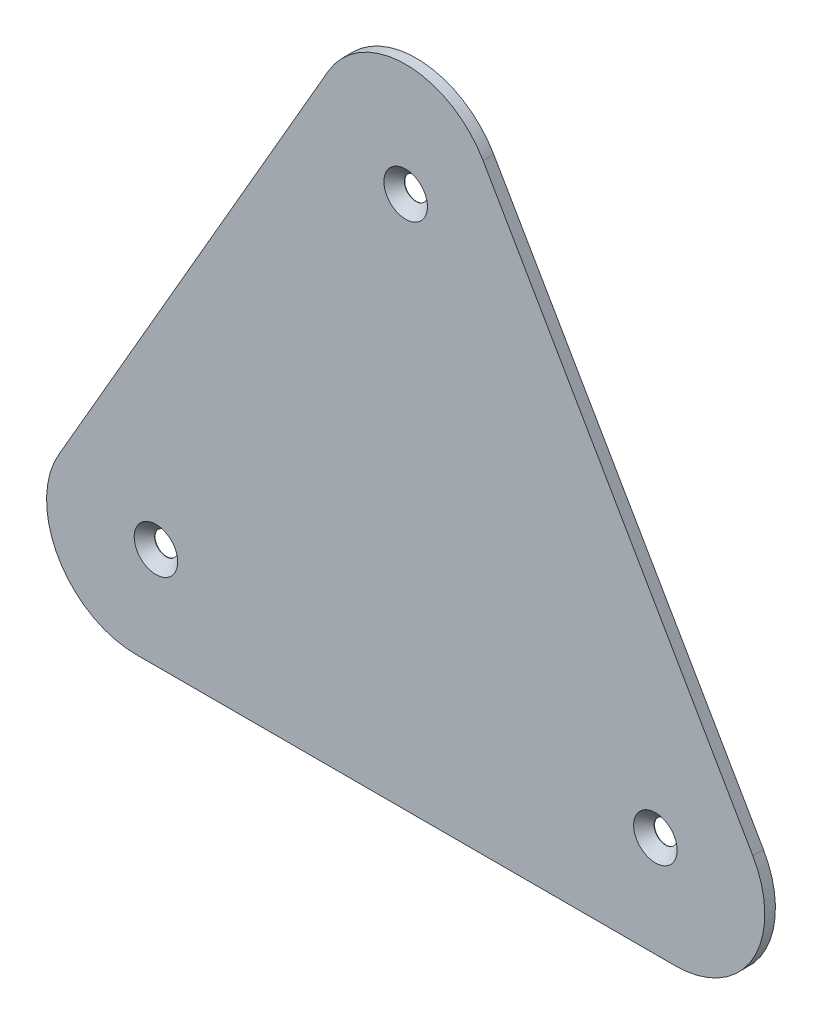
ISO-10303-21;
HEADER;
FILE_DESCRIPTION(('STEP AP214'),'2;1');
FILE_NAME('part.step','',(''),(''),'','','');
FILE_SCHEMA(('AUTOMOTIVE_DESIGN { 1 0 10303 214 1 1 1 1 }'));
ENDSEC;
DATA;
#1=APPLICATION_CONTEXT('core data for automotive mechanical design processes');
#2=APPLICATION_PROTOCOL_DEFINITION('international standard','automotive_design',2000,#1);
#3=PRODUCT_CONTEXT('',#1,'mechanical');
#4=PRODUCT('Part','Part','',(#3));
#5=PRODUCT_RELATED_PRODUCT_CATEGORY('part','',(#4));
#6=PRODUCT_DEFINITION_FORMATION('','',#4);
#7=PRODUCT_DEFINITION_CONTEXT('part definition',#1,'design');
#8=PRODUCT_DEFINITION('design','',#6,#7);
#9=PRODUCT_DEFINITION_SHAPE('','',#8);
#10=(LENGTH_UNIT() NAMED_UNIT(*) SI_UNIT(.MILLI.,.METRE.));
#11=(NAMED_UNIT(*) PLANE_ANGLE_UNIT() SI_UNIT($,.RADIAN.));
#12=(NAMED_UNIT(*) SI_UNIT($,.STERADIAN.) SOLID_ANGLE_UNIT());
#13=UNCERTAINTY_MEASURE_WITH_UNIT(LENGTH_MEASURE(1.E-05),#10,'distance_accuracy_value','');
#14=(GEOMETRIC_REPRESENTATION_CONTEXT(3) GLOBAL_UNCERTAINTY_ASSIGNED_CONTEXT((#13)) GLOBAL_UNIT_ASSIGNED_CONTEXT((#10,
#11,#12)) REPRESENTATION_CONTEXT('',''));
#15=CARTESIAN_POINT('',(0.,0.,0.));
#16=DIRECTION('',(0.,0.,1.));
#17=DIRECTION('',(1.,0.,0.));
#18=AXIS2_PLACEMENT_3D('',#15,#16,#17);
#19=CARTESIAN_POINT('',(-128.587500000001,-74.2400277394202,5.08));
#20=DIRECTION('',(0.,0.,-1.));
#21=DIRECTION('',(-1.,0.,0.));
#22=AXIS2_PLACEMENT_3D('',#19,#20,#21);
#23=CYLINDRICAL_SURFACE('',#22,42.6274583908688);
#24=CARTESIAN_POINT('',(-128.587500000001,-74.2400277394202,0.));
#25=DIRECTION('',(0.,0.,1.));
#26=DIRECTION('',(1.,0.,0.));
#27=AXIS2_PLACEMENT_3D('',#24,#25,#26);
#28=CIRCLE('',#27,42.6274583908688);
#29=CARTESIAN_POINT('',(-165.503961865257,-52.9262985439855,0.));
#30=VERTEX_POINT('',#29);
#31=CARTESIAN_POINT('',(-128.587499999999,-116.867486130289,0.));
#32=VERTEX_POINT('',#31);
#33=EDGE_CURVE('E120',#30,#32,#28,.T.);
#34=ORIENTED_EDGE('',*,*,#33,.T.);
#35=DIRECTION('',(0.,0.,-1.));
#36=VECTOR('',#35,1.);
#37=CARTESIAN_POINT('',(-128.587499999999,-116.867486130289,5.08));
#38=LINE('',#37,#36);
#39=CARTESIAN_POINT('',(-128.587499999999,-116.867486130289,5.08));
#40=VERTEX_POINT('',#39);
#41=EDGE_CURVE('E11',#40,#32,#38,.T.);
#42=ORIENTED_EDGE('',*,*,#41,.F.);
#43=CARTESIAN_POINT('',(-128.587500000001,-74.2400277394202,5.08));
#44=DIRECTION('',(0.,0.,1.));
#45=DIRECTION('',(1.,0.,0.));
#46=AXIS2_PLACEMENT_3D('',#43,#44,#45);
#47=CIRCLE('',#46,42.6274583908688);
#48=CARTESIAN_POINT('',(-165.503961865257,-52.9262985439855,5.08));
#49=VERTEX_POINT('',#48);
#50=EDGE_CURVE('E131',#49,#40,#47,.T.);
#51=ORIENTED_EDGE('',*,*,#50,.F.);
#52=DIRECTION('',(0.,0.,-1.));
#53=VECTOR('',#52,1.);
#54=CARTESIAN_POINT('',(-165.503961865257,-52.9262985439855,5.08));
#55=LINE('',#54,#53);
#56=EDGE_CURVE('E116',#49,#30,#55,.T.);
#57=ORIENTED_EDGE('',*,*,#56,.T.);
#58=EDGE_LOOP('',(#34,#42,#51,#57));
#59=FACE_BOUND('',#58,.T.);
#60=ADVANCED_FACE('F36',(#59),#23,.T.);
#61=CARTESIAN_POINT('',(-128.587499999999,-116.867486130289,5.08));
#62=DIRECTION('',(0.,1.,0.));
#63=DIRECTION('',(-1.,0.,0.));
#64=AXIS2_PLACEMENT_3D('',#61,#62,#63);
#65=PLANE('',#64);
#66=DIRECTION('',(1.,0.,0.));
#67=VECTOR('',#66,1.);
#68=CARTESIAN_POINT('',(-128.587499999999,-116.867486130289,0.));
#69=LINE('',#68,#67);
#70=CARTESIAN_POINT('',(128.587500000001,-116.867486130289,0.));
#71=VERTEX_POINT('',#70);
#72=EDGE_CURVE('E123',#32,#71,#69,.T.);
#73=ORIENTED_EDGE('',*,*,#72,.T.);
#74=DIRECTION('',(0.,0.,-1.));
#75=VECTOR('',#74,1.);
#76=CARTESIAN_POINT('',(128.587500000001,-116.867486130289,5.08));
#77=LINE('',#76,#75);
#78=CARTESIAN_POINT('',(128.587500000001,-116.867486130289,5.08));
#79=VERTEX_POINT('',#78);
#80=EDGE_CURVE('E44',#79,#71,#77,.T.);
#81=ORIENTED_EDGE('',*,*,#80,.F.);
#82=DIRECTION('',(1.,0.,0.));
#83=VECTOR('',#82,1.);
#84=CARTESIAN_POINT('',(-128.587499999999,-116.867486130289,5.08));
#85=LINE('',#84,#83);
#86=EDGE_CURVE('E89',#40,#79,#85,.T.);
#87=ORIENTED_EDGE('',*,*,#86,.F.);
#88=ORIENTED_EDGE('',*,*,#41,.T.);
#89=EDGE_LOOP('',(#73,#81,#87,#88));
#90=FACE_BOUND('',#89,.T.);
#91=ADVANCED_FACE('F156',(#90),#65,.F.);
#92=CARTESIAN_POINT('',(128.587500000001,-74.2400277394202,5.08));
#93=DIRECTION('',(0.,0.,-1.));
#94=DIRECTION('',(-1.,0.,0.));
#95=AXIS2_PLACEMENT_3D('',#92,#93,#94);
#96=CYLINDRICAL_SURFACE('',#95,42.6274583908688);
#97=CARTESIAN_POINT('',(128.587500000001,-74.2400277394202,0.));
#98=DIRECTION('',(0.,0.,1.));
#99=DIRECTION('',(1.,0.,0.));
#100=AXIS2_PLACEMENT_3D('',#97,#98,#99);
#101=CIRCLE('',#100,42.6274583908688);
#102=CARTESIAN_POINT('',(165.503961865257,-52.9262985439856,0.));
#103=VERTEX_POINT('',#102);
#104=EDGE_CURVE('E126',#71,#103,#101,.T.);
#105=ORIENTED_EDGE('',*,*,#104,.T.);
#106=DIRECTION('',(0.,0.,-1.));
#107=VECTOR('',#106,1.);
#108=CARTESIAN_POINT('',(165.503961865257,-52.9262985439856,5.08));
#109=LINE('',#108,#107);
#110=CARTESIAN_POINT('',(165.503961865257,-52.9262985439856,5.08));
#111=VERTEX_POINT('',#110);
#112=EDGE_CURVE('E111',#111,#103,#109,.T.);
#113=ORIENTED_EDGE('',*,*,#112,.F.);
#114=CARTESIAN_POINT('',(128.587500000001,-74.2400277394202,5.08));
#115=DIRECTION('',(0.,0.,1.));
#116=DIRECTION('',(1.,0.,0.));
#117=AXIS2_PLACEMENT_3D('',#114,#115,#116);
#118=CIRCLE('',#117,42.6274583908688);
#119=EDGE_CURVE('E102',#79,#111,#118,.T.);
#120=ORIENTED_EDGE('',*,*,#119,.F.);
#121=ORIENTED_EDGE('',*,*,#80,.T.);
#122=EDGE_LOOP('',(#105,#113,#120,#121));
#123=FACE_BOUND('',#122,.T.);
#124=ADVANCED_FACE('F137',(#123),#96,.T.);
#125=CARTESIAN_POINT('',(165.503961865257,-52.9262985439856,5.08));
#126=DIRECTION('',(-0.866025403784436,-0.500000000000004,0.));
#127=DIRECTION('',(0.500000000000004,-0.866025403784436,0.));
#128=AXIS2_PLACEMENT_3D('',#125,#126,#127);
#129=PLANE('',#128);
#130=DIRECTION('',(-0.500000000000004,0.866025403784436,0.));
#131=VECTOR('',#130,1.);
#132=CARTESIAN_POINT('',(165.503961865257,-52.9262985439856,0.));
#133=LINE('',#132,#131);
#134=CARTESIAN_POINT('',(36.9164618652564,169.793784674277,0.));
#135=VERTEX_POINT('',#134);
#136=EDGE_CURVE('E110',#103,#135,#133,.T.);
#137=ORIENTED_EDGE('',*,*,#136,.T.);
#138=DIRECTION('',(0.,0.,-1.));
#139=VECTOR('',#138,1.);
#140=CARTESIAN_POINT('',(36.9164618652564,169.793784674277,5.08));
#141=LINE('',#140,#139);
#142=CARTESIAN_POINT('',(36.9164618652564,169.793784674277,5.08));
#143=VERTEX_POINT('',#142);
#144=EDGE_CURVE('E107',#143,#135,#141,.T.);
#145=ORIENTED_EDGE('',*,*,#144,.F.);
#146=DIRECTION('',(-0.500000000000004,0.866025403784436,0.));
#147=VECTOR('',#146,1.);
#148=CARTESIAN_POINT('',(165.503961865257,-52.9262985439856,5.08));
#149=LINE('',#148,#147);
#150=EDGE_CURVE('E96',#111,#143,#149,.T.);
#151=ORIENTED_EDGE('',*,*,#150,.F.);
#152=ORIENTED_EDGE('',*,*,#112,.T.);
#153=EDGE_LOOP('',(#137,#145,#151,#152));
#154=FACE_BOUND('',#153,.T.);
#155=ADVANCED_FACE('F108',(#154),#129,.F.);
#156=CARTESIAN_POINT('',(0.,148.480055478842,5.08));
#157=DIRECTION('',(0.,0.,-1.));
#158=DIRECTION('',(-1.,0.,0.));
#159=AXIS2_PLACEMENT_3D('',#156,#157,#158);
#160=CYLINDRICAL_SURFACE('',#159,42.6274583908688);
#161=CARTESIAN_POINT('',(0.,148.480055478842,0.));
#162=DIRECTION('',(0.,0.,1.));
#163=DIRECTION('',(1.,0.,0.));
#164=AXIS2_PLACEMENT_3D('',#161,#162,#163);
#165=CIRCLE('',#164,42.6274583908688);
#166=CARTESIAN_POINT('',(-36.9164618652564,169.793784674277,0.));
#167=VERTEX_POINT('',#166);
#168=EDGE_CURVE('E75',#135,#167,#165,.T.);
#169=ORIENTED_EDGE('',*,*,#168,.T.);
#170=DIRECTION('',(0.,0.,-1.));
#171=VECTOR('',#170,1.);
#172=CARTESIAN_POINT('',(-36.9164618652564,169.793784674277,5.08));
#173=LINE('',#172,#171);
#174=CARTESIAN_POINT('',(-36.9164618652564,169.793784674277,5.08));
#175=VERTEX_POINT('',#174);
#176=EDGE_CURVE('E112',#175,#167,#173,.T.);
#177=ORIENTED_EDGE('',*,*,#176,.F.);
#178=CARTESIAN_POINT('',(0.,148.480055478842,5.08));
#179=DIRECTION('',(0.,0.,1.));
#180=DIRECTION('',(1.,0.,0.));
#181=AXIS2_PLACEMENT_3D('',#178,#179,#180);
#182=CIRCLE('',#181,42.6274583908688);
#183=EDGE_CURVE('E100',#143,#175,#182,.T.);
#184=ORIENTED_EDGE('',*,*,#183,.F.);
#185=ORIENTED_EDGE('',*,*,#144,.T.);
#186=EDGE_LOOP('',(#169,#177,#184,#185));
#187=FACE_BOUND('',#186,.T.);
#188=ADVANCED_FACE('F114',(#187),#160,.T.);
#189=CARTESIAN_POINT('',(-36.9164618652564,169.793784674277,5.08));
#190=DIRECTION('',(0.866025403784436,-0.500000000000004,0.));
#191=DIRECTION('',(0.500000000000004,0.866025403784437,0.));
#192=AXIS2_PLACEMENT_3D('',#189,#190,#191);
#193=PLANE('',#192);
#194=DIRECTION('',(-0.500000000000004,-0.866025403784436,0.));
#195=VECTOR('',#194,1.);
#196=CARTESIAN_POINT('',(-36.9164618652564,169.793784674277,0.));
#197=LINE('',#196,#195);
#198=EDGE_CURVE('E81',#167,#30,#197,.T.);
#199=ORIENTED_EDGE('',*,*,#198,.T.);
#200=ORIENTED_EDGE('',*,*,#56,.F.);
#201=DIRECTION('',(-0.500000000000004,-0.866025403784436,0.));
#202=VECTOR('',#201,1.);
#203=CARTESIAN_POINT('',(-36.9164618652564,169.793784674277,5.08));
#204=LINE('',#203,#202);
#205=EDGE_CURVE('E52',#175,#49,#204,.T.);
#206=ORIENTED_EDGE('',*,*,#205,.F.);
#207=ORIENTED_EDGE('',*,*,#176,.T.);
#208=EDGE_LOOP('',(#199,#200,#206,#207));
#209=FACE_BOUND('',#208,.T.);
#210=ADVANCED_FACE('F144',(#209),#193,.F.);
#211=CARTESIAN_POINT('',(-128.587500000001,-74.2400277394202,5.08));
#212=DIRECTION('',(0.,0.,1.));
#213=DIRECTION('',(1.,0.,0.));
#214=AXIS2_PLACEMENT_3D('',#211,#212,#213);
#215=PLANE('',#214);
#216=CARTESIAN_POINT('',(0.,137.48153285078,5.08));
#217=DIRECTION('',(0.,0.,1.));
#218=DIRECTION('',(1.,0.,0.));
#219=AXIS2_PLACEMENT_3D('',#216,#217,#218);
#220=CIRCLE('',#219,10.381);
#221=CARTESIAN_POINT('',(10.381,137.48153285078,5.08));
#222=VERTEX_POINT('',#221);
#223=EDGE_CURVE('E262',#222,#222,#220,.T.);
#224=ORIENTED_EDGE('',*,*,#223,.F.);
#225=EDGE_LOOP('',(#224));
#226=FACE_BOUND('',#225,.T.);
#227=CARTESIAN_POINT('',(-119.0625,-68.7407664253898,5.08));
#228=DIRECTION('',(0.,0.,1.));
#229=DIRECTION('',(1.,0.,0.));
#230=AXIS2_PLACEMENT_3D('',#227,#228,#229);
#231=CIRCLE('',#230,10.381);
#232=CARTESIAN_POINT('',(-108.6815,-68.7407664253898,5.08));
#233=VERTEX_POINT('',#232);
#234=EDGE_CURVE('E269',#233,#233,#231,.T.);
#235=ORIENTED_EDGE('',*,*,#234,.F.);
#236=EDGE_LOOP('',(#235));
#237=FACE_BOUND('',#236,.T.);
#238=CARTESIAN_POINT('',(119.0625,-68.7407664253898,5.08));
#239=DIRECTION('',(0.,0.,1.));
#240=DIRECTION('',(1.,0.,0.));
#241=AXIS2_PLACEMENT_3D('',#238,#239,#240);
#242=CIRCLE('',#241,10.381);
#243=CARTESIAN_POINT('',(129.4435,-68.7407664253898,5.08));
#244=VERTEX_POINT('',#243);
#245=EDGE_CURVE('E278',#244,#244,#242,.T.);
#246=ORIENTED_EDGE('',*,*,#245,.F.);
#247=EDGE_LOOP('',(#246));
#248=FACE_BOUND('',#247,.T.);
#249=ORIENTED_EDGE('',*,*,#50,.T.);
#250=ORIENTED_EDGE('',*,*,#86,.T.);
#251=ORIENTED_EDGE('',*,*,#119,.T.);
#252=ORIENTED_EDGE('',*,*,#150,.T.);
#253=ORIENTED_EDGE('',*,*,#183,.T.);
#254=ORIENTED_EDGE('',*,*,#205,.T.);
#255=EDGE_LOOP('',(#249,#250,#251,#252,#253,#254));
#256=FACE_BOUND('',#255,.T.);
#257=ADVANCED_FACE('F98',(#226,#237,#248,#256),#215,.T.);
#258=CARTESIAN_POINT('',(-128.587500000001,-74.2400277394202,0.));
#259=DIRECTION('',(0.,0.,1.));
#260=DIRECTION('',(1.,0.,0.));
#261=AXIS2_PLACEMENT_3D('',#258,#259,#260);
#262=PLANE('',#261);
#263=CARTESIAN_POINT('',(0.,137.48153285078,0.));
#264=DIRECTION('',(0.,0.,1.));
#265=DIRECTION('',(1.,0.,0.));
#266=AXIS2_PLACEMENT_3D('',#263,#264,#265);
#267=CIRCLE('',#266,5.5);
#268=CARTESIAN_POINT('',(5.5,137.48153285078,0.));
#269=VERTEX_POINT('',#268);
#270=EDGE_CURVE('E264',#269,#269,#267,.T.);
#271=ORIENTED_EDGE('',*,*,#270,.T.);
#272=EDGE_LOOP('',(#271));
#273=FACE_BOUND('',#272,.T.);
#274=CARTESIAN_POINT('',(-119.0625,-68.7407664253898,0.));
#275=DIRECTION('',(0.,0.,1.));
#276=DIRECTION('',(1.,0.,0.));
#277=AXIS2_PLACEMENT_3D('',#274,#275,#276);
#278=CIRCLE('',#277,5.50000000000001);
#279=CARTESIAN_POINT('',(-113.5625,-68.7407664253898,0.));
#280=VERTEX_POINT('',#279);
#281=EDGE_CURVE('E275',#280,#280,#278,.T.);
#282=ORIENTED_EDGE('',*,*,#281,.T.);
#283=EDGE_LOOP('',(#282));
#284=FACE_BOUND('',#283,.T.);
#285=CARTESIAN_POINT('',(119.0625,-68.7407664253898,0.));
#286=DIRECTION('',(0.,0.,1.));
#287=DIRECTION('',(1.,0.,0.));
#288=AXIS2_PLACEMENT_3D('',#285,#286,#287);
#289=CIRCLE('',#288,5.50000000000001);
#290=CARTESIAN_POINT('',(124.5625,-68.7407664253898,0.));
#291=VERTEX_POINT('',#290);
#292=EDGE_CURVE('E124',#291,#291,#289,.T.);
#293=ORIENTED_EDGE('',*,*,#292,.T.);
#294=EDGE_LOOP('',(#293));
#295=FACE_BOUND('',#294,.T.);
#296=ORIENTED_EDGE('',*,*,#33,.F.);
#297=ORIENTED_EDGE('',*,*,#198,.F.);
#298=ORIENTED_EDGE('',*,*,#168,.F.);
#299=ORIENTED_EDGE('',*,*,#136,.F.);
#300=ORIENTED_EDGE('',*,*,#104,.F.);
#301=ORIENTED_EDGE('',*,*,#72,.F.);
#302=EDGE_LOOP('',(#296,#297,#298,#299,#300,#301));
#303=FACE_BOUND('',#302,.T.);
#304=ADVANCED_FACE('F140',(#273,#284,#295,#303),#262,.F.);
#305=CARTESIAN_POINT('',(119.0625,-68.7407664253898,5.08));
#306=DIRECTION('',(0.,0.,1.));
#307=DIRECTION('',(1.,0.,0.));
#308=AXIS2_PLACEMENT_3D('',#305,#306,#307);
#309=CYLINDRICAL_SURFACE('',#308,5.50000000000001);
#310=ORIENTED_EDGE('',*,*,#292,.F.);
#311=EDGE_LOOP('',(#310));
#312=FACE_BOUND('',#311,.T.);
#313=CARTESIAN_POINT('',(119.0625,-68.7407664253898,0.199));
#314=DIRECTION('',(0.,0.,1.));
#315=DIRECTION('',(1.,0.,0.));
#316=AXIS2_PLACEMENT_3D('',#313,#314,#315);
#317=CIRCLE('',#316,5.50000000000001);
#318=CARTESIAN_POINT('',(124.5625,-68.7407664253898,0.199));
#319=VERTEX_POINT('',#318);
#320=EDGE_CURVE('E281',#319,#319,#317,.T.);
#321=ORIENTED_EDGE('',*,*,#320,.T.);
#322=EDGE_LOOP('',(#321));
#323=FACE_BOUND('',#322,.T.);
#324=ADVANCED_FACE('F193',(#312,#323),#309,.F.);
#325=CARTESIAN_POINT('',(119.0625,-68.7407664253898,5.08));
#326=DIRECTION('',(0.,0.,1.));
#327=DIRECTION('',(1.,0.,0.));
#328=AXIS2_PLACEMENT_3D('',#325,#326,#327);
#329=CONICAL_SURFACE('',#328,10.381,0.785398163397448);
#330=ORIENTED_EDGE('',*,*,#320,.F.);
#331=EDGE_LOOP('',(#330));
#332=FACE_BOUND('',#331,.T.);
#333=ORIENTED_EDGE('',*,*,#245,.T.);
#334=EDGE_LOOP('',(#333));
#335=FACE_BOUND('',#334,.T.);
#336=ADVANCED_FACE('F202',(#332,#335),#329,.F.);
#337=CARTESIAN_POINT('',(-119.0625,-68.7407664253898,5.08));
#338=DIRECTION('',(0.,0.,1.));
#339=DIRECTION('',(1.,0.,0.));
#340=AXIS2_PLACEMENT_3D('',#337,#338,#339);
#341=CYLINDRICAL_SURFACE('',#340,5.50000000000001);
#342=ORIENTED_EDGE('',*,*,#281,.F.);
#343=EDGE_LOOP('',(#342));
#344=FACE_BOUND('',#343,.T.);
#345=CARTESIAN_POINT('',(-119.0625,-68.7407664253898,0.199));
#346=DIRECTION('',(0.,0.,1.));
#347=DIRECTION('',(1.,0.,0.));
#348=AXIS2_PLACEMENT_3D('',#345,#346,#347);
#349=CIRCLE('',#348,5.50000000000001);
#350=CARTESIAN_POINT('',(-113.5625,-68.7407664253898,0.199));
#351=VERTEX_POINT('',#350);
#352=EDGE_CURVE('E272',#351,#351,#349,.T.);
#353=ORIENTED_EDGE('',*,*,#352,.T.);
#354=EDGE_LOOP('',(#353));
#355=FACE_BOUND('',#354,.T.);
#356=ADVANCED_FACE('F212',(#344,#355),#341,.F.);
#357=CARTESIAN_POINT('',(-119.0625,-68.7407664253898,5.08));
#358=DIRECTION('',(0.,0.,1.));
#359=DIRECTION('',(1.,0.,0.));
#360=AXIS2_PLACEMENT_3D('',#357,#358,#359);
#361=CONICAL_SURFACE('',#360,10.381,0.785398163397448);
#362=ORIENTED_EDGE('',*,*,#352,.F.);
#363=EDGE_LOOP('',(#362));
#364=FACE_BOUND('',#363,.T.);
#365=ORIENTED_EDGE('',*,*,#234,.T.);
#366=EDGE_LOOP('',(#365));
#367=FACE_BOUND('',#366,.T.);
#368=ADVANCED_FACE('F222',(#364,#367),#361,.F.);
#369=CARTESIAN_POINT('',(0.,137.48153285078,5.08));
#370=DIRECTION('',(0.,0.,1.));
#371=DIRECTION('',(1.,0.,0.));
#372=AXIS2_PLACEMENT_3D('',#369,#370,#371);
#373=CYLINDRICAL_SURFACE('',#372,5.5);
#374=ORIENTED_EDGE('',*,*,#270,.F.);
#375=EDGE_LOOP('',(#374));
#376=FACE_BOUND('',#375,.T.);
#377=CARTESIAN_POINT('',(0.,137.48153285078,0.199));
#378=DIRECTION('',(0.,0.,1.));
#379=DIRECTION('',(1.,0.,0.));
#380=AXIS2_PLACEMENT_3D('',#377,#378,#379);
#381=CIRCLE('',#380,5.5);
#382=CARTESIAN_POINT('',(5.5,137.48153285078,0.199));
#383=VERTEX_POINT('',#382);
#384=EDGE_CURVE('E259',#383,#383,#381,.T.);
#385=ORIENTED_EDGE('',*,*,#384,.T.);
#386=EDGE_LOOP('',(#385));
#387=FACE_BOUND('',#386,.T.);
#388=ADVANCED_FACE('F232',(#376,#387),#373,.F.);
#389=CARTESIAN_POINT('',(0.,137.48153285078,5.08));
#390=DIRECTION('',(0.,0.,1.));
#391=DIRECTION('',(1.,0.,0.));
#392=AXIS2_PLACEMENT_3D('',#389,#390,#391);
#393=CONICAL_SURFACE('',#392,10.381,0.785398163397448);
#394=ORIENTED_EDGE('',*,*,#384,.F.);
#395=EDGE_LOOP('',(#394));
#396=FACE_BOUND('',#395,.T.);
#397=ORIENTED_EDGE('',*,*,#223,.T.);
#398=EDGE_LOOP('',(#397));
#399=FACE_BOUND('',#398,.T.);
#400=ADVANCED_FACE('F242',(#396,#399),#393,.F.);
#401=CLOSED_SHELL('',(#60,#91,#124,#155,#188,#210,#257,#304,#324,#336,#356,#368,#388,#400));
#402=MANIFOLD_SOLID_BREP('B2',#401);
#403=ADVANCED_BREP_SHAPE_REPRESENTATION('',(#18,#402),#14);
#404=SHAPE_DEFINITION_REPRESENTATION(#9,#403);
ENDSEC;
END-ISO-10303-21;
